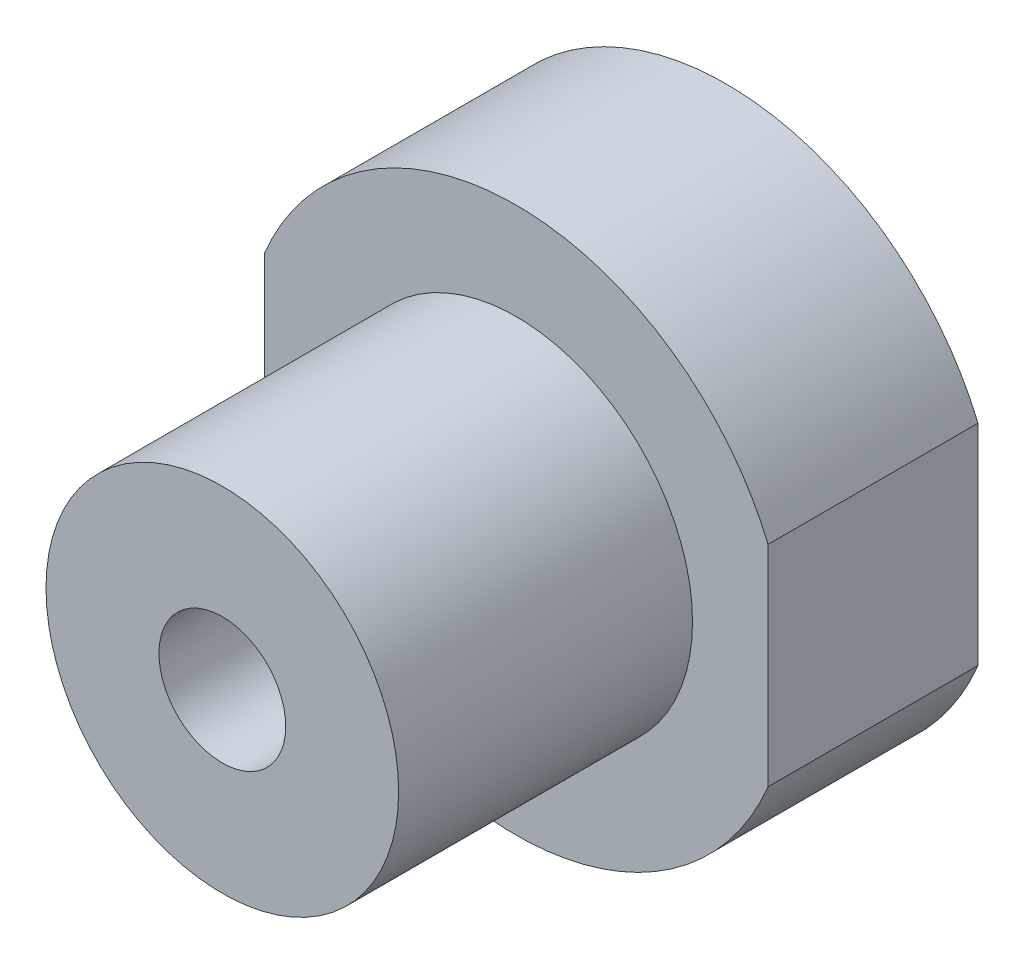
ISO-10303-21;
HEADER;
FILE_DESCRIPTION(('STEP AP214'),'2;1');
FILE_NAME('part.step','',(''),(''),'','','');
FILE_SCHEMA(('AUTOMOTIVE_DESIGN { 1 0 10303 214 1 1 1 1 }'));
ENDSEC;
DATA;
#1=APPLICATION_CONTEXT('core data for automotive mechanical design processes');
#2=APPLICATION_PROTOCOL_DEFINITION('international standard','automotive_design',2000,#1);
#3=PRODUCT_CONTEXT('',#1,'mechanical');
#4=PRODUCT('Part','Part','',(#3));
#5=PRODUCT_RELATED_PRODUCT_CATEGORY('part','',(#4));
#6=PRODUCT_DEFINITION_FORMATION('','',#4);
#7=PRODUCT_DEFINITION_CONTEXT('part definition',#1,'design');
#8=PRODUCT_DEFINITION('design','',#6,#7);
#9=PRODUCT_DEFINITION_SHAPE('','',#8);
#10=(LENGTH_UNIT() NAMED_UNIT(*) SI_UNIT(.MILLI.,.METRE.));
#11=(NAMED_UNIT(*) PLANE_ANGLE_UNIT() SI_UNIT($,.RADIAN.));
#12=(NAMED_UNIT(*) SI_UNIT($,.STERADIAN.) SOLID_ANGLE_UNIT());
#13=UNCERTAINTY_MEASURE_WITH_UNIT(LENGTH_MEASURE(1.E-05),#10,'distance_accuracy_value','');
#14=(GEOMETRIC_REPRESENTATION_CONTEXT(3) GLOBAL_UNCERTAINTY_ASSIGNED_CONTEXT((#13)) GLOBAL_UNIT_ASSIGNED_CONTEXT((#10,
#11,#12)) REPRESENTATION_CONTEXT('',''));
#15=CARTESIAN_POINT('',(0.,0.,0.));
#16=DIRECTION('',(0.,0.,1.));
#17=DIRECTION('',(1.,0.,0.));
#18=AXIS2_PLACEMENT_3D('',#15,#16,#17);
#19=CARTESIAN_POINT('',(0.,0.,12.));
#20=DIRECTION('',(0.,0.,-1.));
#21=DIRECTION('',(-1.,0.,0.));
#22=AXIS2_PLACEMENT_3D('',#19,#20,#21);
#23=CYLINDRICAL_SURFACE('',#22,6.5);
#24=CARTESIAN_POINT('',(0.,0.,5.));
#25=DIRECTION('',(0.,0.,1.));
#26=DIRECTION('',(1.,0.,0.));
#27=AXIS2_PLACEMENT_3D('',#24,#25,#26);
#28=CIRCLE('',#27,6.5);
#29=CARTESIAN_POINT('',(-6.,-2.5,5.));
#30=VERTEX_POINT('',#29);
#31=CARTESIAN_POINT('',(6.,-2.5,5.));
#32=VERTEX_POINT('',#31);
#33=EDGE_CURVE('E87',#30,#32,#28,.T.);
#34=ORIENTED_EDGE('',*,*,#33,.F.);
#35=DIRECTION('',(0.,0.,-1.));
#36=VECTOR('',#35,1.);
#37=CARTESIAN_POINT('',(-6.,-2.5,32.0777237780431));
#38=LINE('',#37,#36);
#39=CARTESIAN_POINT('',(-6.,-2.5,0.));
#40=VERTEX_POINT('',#39);
#41=EDGE_CURVE('E51',#30,#40,#38,.T.);
#42=ORIENTED_EDGE('',*,*,#41,.T.);
#43=CARTESIAN_POINT('',(0.,0.,0.));
#44=DIRECTION('',(0.,0.,1.));
#45=DIRECTION('',(1.,0.,0.));
#46=AXIS2_PLACEMENT_3D('',#43,#44,#45);
#47=CIRCLE('',#46,6.5);
#48=CARTESIAN_POINT('',(6.,-2.5,0.));
#49=VERTEX_POINT('',#48);
#50=EDGE_CURVE('E86',#40,#49,#47,.T.);
#51=ORIENTED_EDGE('',*,*,#50,.T.);
#52=DIRECTION('',(0.,0.,-1.));
#53=VECTOR('',#52,1.);
#54=CARTESIAN_POINT('',(6.,-2.5,38.6931230001252));
#55=LINE('',#54,#53);
#56=EDGE_CURVE('E99',#32,#49,#55,.T.);
#57=ORIENTED_EDGE('',*,*,#56,.F.);
#58=EDGE_LOOP('',(#34,#42,#51,#57));
#59=FACE_BOUND('',#58,.T.);
#60=ADVANCED_FACE('F36',(#59),#23,.T.);
#61=CARTESIAN_POINT('',(6.,2.5,0.));
#62=VERTEX_POINT('',#61);
#63=CARTESIAN_POINT('',(-6.,2.5,0.));
#64=VERTEX_POINT('',#63);
#65=EDGE_CURVE('E91',#62,#64,#47,.T.);
#66=ORIENTED_EDGE('',*,*,#65,.T.);
#67=DIRECTION('',(0.,0.,-1.));
#68=VECTOR('',#67,1.);
#69=CARTESIAN_POINT('',(-6.,2.5,32.0777237780431));
#70=LINE('',#69,#68);
#71=CARTESIAN_POINT('',(-6.,2.5,5.00000000000001));
#72=VERTEX_POINT('',#71);
#73=EDGE_CURVE('E90',#72,#64,#70,.T.);
#74=ORIENTED_EDGE('',*,*,#73,.F.);
#75=CARTESIAN_POINT('',(6.,2.5,5.));
#76=VERTEX_POINT('',#75);
#77=EDGE_CURVE('E79',#76,#72,#28,.T.);
#78=ORIENTED_EDGE('',*,*,#77,.F.);
#79=DIRECTION('',(0.,0.,-1.));
#80=VECTOR('',#79,1.);
#81=CARTESIAN_POINT('',(6.,2.5,38.6931230001252));
#82=LINE('',#81,#80);
#83=EDGE_CURVE('E96',#76,#62,#82,.T.);
#84=ORIENTED_EDGE('',*,*,#83,.T.);
#85=EDGE_LOOP('',(#66,#74,#78,#84));
#86=FACE_BOUND('',#85,.T.);
#87=ADVANCED_FACE('F38',(#86),#23,.T.);
#88=CARTESIAN_POINT('',(0.,0.,0.));
#89=DIRECTION('',(0.,0.,1.));
#90=DIRECTION('',(1.,0.,0.));
#91=AXIS2_PLACEMENT_3D('',#88,#89,#90);
#92=PLANE('',#91);
#93=ORIENTED_EDGE('',*,*,#50,.F.);
#94=DIRECTION('',(0.,1.,0.));
#95=VECTOR('',#94,1.);
#96=CARTESIAN_POINT('',(-6.,0.,0.));
#97=LINE('',#96,#95);
#98=EDGE_CURVE('E58',#40,#64,#97,.T.);
#99=ORIENTED_EDGE('',*,*,#98,.T.);
#100=ORIENTED_EDGE('',*,*,#65,.F.);
#101=DIRECTION('',(0.,1.,0.));
#102=VECTOR('',#101,1.);
#103=CARTESIAN_POINT('',(6.,0.,0.));
#104=LINE('',#103,#102);
#105=EDGE_CURVE('E102',#49,#62,#104,.T.);
#106=ORIENTED_EDGE('',*,*,#105,.F.);
#107=EDGE_LOOP('',(#93,#99,#100,#106));
#108=FACE_BOUND('',#107,.T.);
#109=ADVANCED_FACE('F142',(#108),#92,.F.);
#110=CARTESIAN_POINT('',(0.,0.,5.));
#111=DIRECTION('',(0.,0.,1.));
#112=DIRECTION('',(1.,0.,0.));
#113=AXIS2_PLACEMENT_3D('',#110,#111,#112);
#114=PLANE('',#113);
#115=DIRECTION('',(0.,1.,0.));
#116=VECTOR('',#115,1.);
#117=CARTESIAN_POINT('',(-6.,0.,5.));
#118=LINE('',#117,#116);
#119=EDGE_CURVE('E12',#30,#72,#118,.T.);
#120=ORIENTED_EDGE('',*,*,#119,.F.);
#121=ORIENTED_EDGE('',*,*,#33,.T.);
#122=DIRECTION('',(0.,1.,0.));
#123=VECTOR('',#122,1.);
#124=CARTESIAN_POINT('',(6.,0.,5.));
#125=LINE('',#124,#123);
#126=EDGE_CURVE('E44',#32,#76,#125,.T.);
#127=ORIENTED_EDGE('',*,*,#126,.T.);
#128=ORIENTED_EDGE('',*,*,#77,.T.);
#129=EDGE_LOOP('',(#120,#121,#127,#128));
#130=FACE_BOUND('',#129,.T.);
#131=CARTESIAN_POINT('',(0.,0.,5.));
#132=DIRECTION('',(0.,0.,1.));
#133=DIRECTION('',(1.,0.,0.));
#134=AXIS2_PLACEMENT_3D('',#131,#132,#133);
#135=CIRCLE('',#134,4.2);
#136=CARTESIAN_POINT('',(4.2,0.,5.));
#137=VERTEX_POINT('',#136);
#138=EDGE_CURVE('E153',#137,#137,#135,.T.);
#139=ORIENTED_EDGE('',*,*,#138,.F.);
#140=EDGE_LOOP('',(#139));
#141=FACE_BOUND('',#140,.T.);
#142=ADVANCED_FACE('F81',(#130,#141),#114,.T.);
#143=CARTESIAN_POINT('',(0.,0.,5.));
#144=DIRECTION('',(0.,0.,1.));
#145=DIRECTION('',(1.,0.,0.));
#146=AXIS2_PLACEMENT_3D('',#143,#144,#145);
#147=CYLINDRICAL_SURFACE('',#146,4.2);
#148=CARTESIAN_POINT('',(-4.2,0.,9.8));
#149=CARTESIAN_POINT('',(-4.19999918975716,0.0445050692827186,9.79999831351455));
#150=CARTESIAN_POINT('',(-4.19928531303912,0.0890319340393675,9.79627363588427));
#151=CARTESIAN_POINT('',(-4.19650633670306,0.176830026339232,9.78148345009533));
#152=CARTESIAN_POINT('',(-4.1944401122718,0.220100177296127,9.77041183102234));
#153=CARTESIAN_POINT('',(-4.18918747855958,0.304102472931484,9.74127979887013));
#154=CARTESIAN_POINT('',(-4.18600209548577,0.344836902582766,9.72322578673946));
#155=CARTESIAN_POINT('',(-4.17885862129986,0.422694978519967,9.680659825203));
#156=CARTESIAN_POINT('',(-4.17490058887378,0.459818898718858,9.6561483662185));
#157=CARTESIAN_POINT('',(-4.16659378019184,0.529863819055358,9.60104229368466));
#158=CARTESIAN_POINT('',(-4.16224116830176,0.562733824115327,9.57038343225021));
#159=CARTESIAN_POINT('',(-4.15366410352382,0.622896603773796,9.50399103156161));
#160=CARTESIAN_POINT('',(-4.14943966004354,0.650188969812237,9.46825712088664));
#161=CARTESIAN_POINT('',(-4.14155991678934,0.698634996766379,9.39236709231777));
#162=CARTESIAN_POINT('',(-4.1379095601114,0.719736567014677,9.35217716275601));
#163=CARTESIAN_POINT('',(-4.13164544256769,0.75486848530436,9.26874146295891));
#164=CARTESIAN_POINT('',(-4.12903158931043,0.768899463631998,9.22549596549479));
#165=CARTESIAN_POINT('',(-4.12517508116456,0.789327808131856,9.13772306288837));
#166=CARTESIAN_POINT('',(-4.12391644213396,0.795814233858233,9.09321710185931));
#167=CARTESIAN_POINT('',(-4.12286469754441,0.801245827857894,9.00373215981581));
#168=CARTESIAN_POINT('',(-4.12307145629921,0.80019169433754,8.9587532229809));
#169=CARTESIAN_POINT('',(-4.12491260039502,0.790644259726365,8.87024581490186));
#170=CARTESIAN_POINT('',(-4.12652751367668,0.782252420573193,8.82670593377052));
#171=CARTESIAN_POINT('',(-4.13097240400575,0.758427660713511,8.74166356782844));
#172=CARTESIAN_POINT('',(-4.13380243417989,0.742994432145178,8.70016117218801));
#173=CARTESIAN_POINT('',(-4.14037893640687,0.705426306897761,8.62007604639157));
#174=CARTESIAN_POINT('',(-4.14413095945861,0.683250616774925,8.58151292721929));
#175=CARTESIAN_POINT('',(-4.15212504340384,0.632855889425938,8.50861693675805));
#176=CARTESIAN_POINT('',(-4.15636715554572,0.604636219919831,8.4742845086476));
#177=CARTESIAN_POINT('',(-4.16494817022137,0.542408431522876,8.41023842778877));
#178=CARTESIAN_POINT('',(-4.16928752431716,0.508313572123825,8.38060904908835));
#179=CARTESIAN_POINT('',(-4.17751068538924,0.435593015952664,8.32747750451272));
#180=CARTESIAN_POINT('',(-4.18139448751623,0.396967270958417,8.30397540385862));
#181=CARTESIAN_POINT('',(-4.18827716875703,0.316192152772242,8.26375240166464));
#182=CARTESIAN_POINT('',(-4.19127487630327,0.274038208299115,8.24704046704623));
#183=CARTESIAN_POINT('',(-4.19603859426372,0.187451496048365,8.22095847130397));
#184=CARTESIAN_POINT('',(-4.19780473977526,0.143018978795102,8.21158760488099));
#185=CARTESIAN_POINT('',(-4.19988772003309,0.0538612408665728,8.20057151854554));
#186=CARTESIAN_POINT('',(-4.2002262083733,0.00915077282118806,8.19881086259992));
#187=CARTESIAN_POINT('',(-4.1994756266672,-0.0799256443228178,8.20275524211939));
#188=CARTESIAN_POINT('',(-4.19838662909885,-0.124291610797819,8.2084598985471));
#189=CARTESIAN_POINT('',(-4.19491693619439,-0.211052035228773,8.22707701053263));
#190=CARTESIAN_POINT('',(-4.1925467470456,-0.253459524728257,8.23993086482557));
#191=CARTESIAN_POINT('',(-4.18677936440468,-0.33551748546553,8.27241793898824));
#192=CARTESIAN_POINT('',(-4.18338209946126,-0.375167764654425,8.29205163052914));
#193=CARTESIAN_POINT('',(-4.175883399201,-0.451077080490726,8.33779520206983));
#194=CARTESIAN_POINT('',(-4.17177448000834,-0.487293002507809,8.36397537668185));
#195=CARTESIAN_POINT('',(-4.16332715336028,-0.554858983744039,8.42197386753347));
#196=CARTESIAN_POINT('',(-4.15898872377015,-0.586208572486981,8.45379272828413));
#197=CARTESIAN_POINT('',(-4.1504992386728,-0.643592231069949,8.52268865979902));
#198=CARTESIAN_POINT('',(-4.14635157353834,-0.669547411518764,8.55983192575681));
#199=CARTESIAN_POINT('',(-4.1387822874362,-0.71485025802538,8.63801902788005));
#200=CARTESIAN_POINT('',(-4.13536063896864,-0.734198174368418,8.67906271622096));
#201=CARTESIAN_POINT('',(-4.12965758647247,-0.765626389342317,8.76368838883063));
#202=CARTESIAN_POINT('',(-4.12737059311941,-0.777742373789275,8.80725672576706));
#203=CARTESIAN_POINT('',(-4.12418323447374,-0.79447244488251,8.89585850859045));
#204=CARTESIAN_POINT('',(-4.12328270713451,-0.799087408232481,8.94089178263097));
#205=CARTESIAN_POINT('',(-4.12297864271789,-0.80065437113446,9.03035447569308));
#206=CARTESIAN_POINT('',(-4.12355078592255,-0.797730859810025,9.07478167907047));
#207=CARTESIAN_POINT('',(-4.12607357441173,-0.784576922525489,9.16249891845475));
#208=CARTESIAN_POINT('',(-4.12802421082699,-0.77434654357789,9.2057889617763));
#209=CARTESIAN_POINT('',(-4.13307380831457,-0.746922507433793,9.28993321942199));
#210=CARTESIAN_POINT('',(-4.13617047660353,-0.729742747023456,9.33079210940258));
#211=CARTESIAN_POINT('',(-4.14316476734079,-0.688921385354746,9.40906739047722));
#212=CARTESIAN_POINT('',(-4.14706244886079,-0.6652793074823,9.44648352738638));
#213=CARTESIAN_POINT('',(-4.15529483720025,-0.61177339459019,9.51743392706396));
#214=CARTESIAN_POINT('',(-4.15963536316529,-0.58181912036121,9.550899323472));
#215=CARTESIAN_POINT('',(-4.16822125389376,-0.516727266780006,9.61237013600578));
#216=CARTESIAN_POINT('',(-4.17246659657047,-0.481588498447137,9.64037429625506));
#217=CARTESIAN_POINT('',(-4.18043033987948,-0.406731751047044,9.69037260514626));
#218=CARTESIAN_POINT('',(-4.18414345046217,-0.366974080018692,9.71230819816285));
#219=CARTESIAN_POINT('',(-4.19057261857685,-0.284279155063621,9.7491531353614));
#220=CARTESIAN_POINT('',(-4.19328960334228,-0.24134490300338,9.76406901745668));
#221=CARTESIAN_POINT('',(-4.19687250857602,-0.165242674233967,9.7834549491363));
#222=CARTESIAN_POINT('',(-4.19803863895636,-0.132516977430961,9.7896486339844));
#223=CARTESIAN_POINT('',(-4.19960267722617,-0.0665315713578867,9.79792173460682));
#224=CARTESIAN_POINT('',(-4.20000060573549,-0.0332718764454042,9.80000126081223));
#225=CARTESIAN_POINT('',(-4.2,0.,9.8));
#226=B_SPLINE_CURVE_WITH_KNOTS('',3,(#148,#149,#150,#151,#152,#153,#154,#155,#156,#157,#158,
#159,#160,#161,#162,#163,#164,#165,#166,#167,#168,#169,#170,#171,#172,#173,#174,#175,#176,#177,
#178,#179,#180,#181,#182,#183,#184,#185,#186,#187,#188,#189,#190,#191,#192,#193,#194,#195,#196,
#197,#198,#199,#200,#201,#202,#203,#204,#205,#206,#207,#208,#209,#210,#211,#212,#213,#214,#215,
#216,#217,#218,#219,#220,#221,#222,#223,#224,#225),.UNSPECIFIED.,.T.,.F.,(4,2,2,2,2,2,2,2,2,2,2,
2,2,2,2,2,2,2,2,2,2,2,2,2,2,2,2,2,2,2,2,2,2,2,2,2,2,2,4),(0.,0.133393520972016,
0.266898133049502,0.400280646833109,0.53365303358406,0.668499713214935,0.80335626677924,
0.939316968024612,1.075265547325,1.2095924925506,1.34390700014252,1.4763931346295,
1.60888506219647,1.7421951095463,1.87551910970308,2.01101318237692,2.14650869724269,
2.28218256699814,2.41784155154178,2.55143539720534,2.68502246015263,2.81753032607892,
2.95004741239425,3.0840536114793,3.21807275820069,3.35393193388066,3.48978596260145,
3.62496395832761,3.76012615359527,3.89307064957235,4.02601429019012,4.15869338531743,
4.29138226854241,4.42612014354719,4.56088896669263,4.69691610068412,4.83281629180201,
4.93254362522872,5.03226828176626),.UNSPECIFIED.);
#227=CARTESIAN_POINT('',(-4.2,0.,9.8));
#228=VERTEX_POINT('',#227);
#229=EDGE_CURVE('E129',#228,#228,#226,.T.);
#230=ORIENTED_EDGE('',*,*,#229,.F.);
#231=EDGE_LOOP('',(#230));
#232=FACE_BOUND('',#231,.T.);
#233=ORIENTED_EDGE('',*,*,#138,.T.);
#234=EDGE_LOOP('',(#233));
#235=FACE_BOUND('',#234,.T.);
#236=CARTESIAN_POINT('',(0.,0.,12.));
#237=DIRECTION('',(0.,0.,1.));
#238=DIRECTION('',(1.,0.,0.));
#239=AXIS2_PLACEMENT_3D('',#236,#237,#238);
#240=CIRCLE('',#239,4.2);
#241=CARTESIAN_POINT('',(4.2,0.,12.));
#242=VERTEX_POINT('',#241);
#243=EDGE_CURVE('E155',#242,#242,#240,.T.);
#244=ORIENTED_EDGE('',*,*,#243,.F.);
#245=EDGE_LOOP('',(#244));
#246=FACE_BOUND('',#245,.T.);
#247=ADVANCED_FACE('F134',(#232,#235,#246),#147,.T.);
#248=CARTESIAN_POINT('',(0.,0.,12.));
#249=DIRECTION('',(0.,0.,1.));
#250=DIRECTION('',(1.,0.,0.));
#251=AXIS2_PLACEMENT_3D('',#248,#249,#250);
#252=PLANE('',#251);
#253=CARTESIAN_POINT('',(0.,0.,12.));
#254=DIRECTION('',(0.,0.,1.));
#255=DIRECTION('',(1.,0.,0.));
#256=AXIS2_PLACEMENT_3D('',#253,#254,#255);
#257=CIRCLE('',#256,1.51);
#258=CARTESIAN_POINT('',(1.51,0.,12.));
#259=VERTEX_POINT('',#258);
#260=EDGE_CURVE('E112',#259,#259,#257,.T.);
#261=ORIENTED_EDGE('',*,*,#260,.F.);
#262=EDGE_LOOP('',(#261));
#263=FACE_BOUND('',#262,.T.);
#264=ORIENTED_EDGE('',*,*,#243,.T.);
#265=EDGE_LOOP('',(#264));
#266=FACE_BOUND('',#265,.T.);
#267=ADVANCED_FACE('F138',(#263,#266),#252,.T.);
#268=CARTESIAN_POINT('',(0.,0.,5.));
#269=DIRECTION('',(0.,0.,1.));
#270=DIRECTION('',(1.,0.,0.));
#271=AXIS2_PLACEMENT_3D('',#268,#269,#270);
#272=CYLINDRICAL_SURFACE('',#271,1.51);
#273=CARTESIAN_POINT('',(-1.51,0.,9.8));
#274=CARTESIAN_POINT('',(-1.50999758320691,0.0417510833330522,9.79999728333977));
#275=CARTESIAN_POINT('',(-1.5082503596257,0.0835426385364564,9.79671254056916));
#276=CARTESIAN_POINT('',(-1.50143280043036,0.16587126846474,9.7837281318983));
#277=CARTESIAN_POINT('',(-1.49635719064945,0.206406245071953,9.77401828454383));
#278=CARTESIAN_POINT('',(-1.48340942306705,0.28490928358444,9.74867967540217));
#279=CARTESIAN_POINT('',(-1.47554854763877,0.322886976421819,9.73307477627369));
#280=CARTESIAN_POINT('',(-1.45773474594787,0.395617804111763,9.69652337717232));
#281=CARTESIAN_POINT('',(-1.44778182785209,0.430370951551433,9.67557689805164));
#282=CARTESIAN_POINT('',(-1.42591133121044,0.498226235408713,9.62738674895102));
#283=CARTESIAN_POINT('',(-1.41390776035784,0.53107105998104,9.59982043798002));
#284=CARTESIAN_POINT('',(-1.38953791191531,0.591912629260072,9.53987585363182));
#285=CARTESIAN_POINT('',(-1.37717133186275,0.619905188746699,9.50749347053541));
#286=CARTESIAN_POINT('',(-1.35218376107951,0.672776923462393,9.4353679064447));
#287=CARTESIAN_POINT('',(-1.33963944940714,0.697151609564679,9.39522501575421));
#288=CARTESIAN_POINT('',(-1.31718530593836,0.738704309259306,9.31069125909295));
#289=CARTESIAN_POINT('',(-1.30727345339324,0.755887848843211,9.26630368726517));
#290=CARTESIAN_POINT('',(-1.29218715062612,0.78138410113511,9.17732237639986));
#291=CARTESIAN_POINT('',(-1.28675596774797,0.790182893621159,9.13291386626607));
#292=CARTESIAN_POINT('',(-1.28060207974399,0.800122940321714,9.04294792178661));
#293=CARTESIAN_POINT('',(-1.27987358237035,0.80127361469393,8.99739197022521));
#294=CARTESIAN_POINT('',(-1.28300633802695,0.796239537306053,8.91322371158308));
#295=CARTESIAN_POINT('',(-1.28624651603498,0.791047660219459,8.87452275997874));
#296=CARTESIAN_POINT('',(-1.29584830152839,0.775217437383522,8.79865367228148));
#297=CARTESIAN_POINT('',(-1.30221113286559,0.764576956108656,8.76148614337476));
#298=CARTESIAN_POINT('',(-1.31746612096692,0.737984560827303,8.68868687590585));
#299=CARTESIAN_POINT('',(-1.32641221809757,0.721917983933765,8.65310886933628));
#300=CARTESIAN_POINT('',(-1.3458372092223,0.685023023364196,8.58497446635857));
#301=CARTESIAN_POINT('',(-1.35631678423809,0.664192521690497,8.55241942301126));
#302=CARTESIAN_POINT('',(-1.37945550081804,0.614855224480314,8.4862961494733));
#303=CARTESIAN_POINT('',(-1.39221059804257,0.585673809839336,8.45326300413945));
#304=CARTESIAN_POINT('',(-1.41725150917399,0.522172149883079,8.39232054994712));
#305=CARTESIAN_POINT('',(-1.42953704032721,0.487848867678317,8.36441429096223));
#306=CARTESIAN_POINT('',(-1.45311880702332,0.412539906674086,8.31297221736981));
#307=CARTESIAN_POINT('',(-1.4643162186282,0.371283143406586,8.28978413150751));
#308=CARTESIAN_POINT('',(-1.48357574501624,0.284714556362572,8.25087799579696));
#309=CARTESIAN_POINT('',(-1.49164062472605,0.239406352248664,8.23515335561052));
#310=CARTESIAN_POINT('',(-1.5031065449172,0.150345796734096,8.21303753523191));
#311=CARTESIAN_POINT('',(-1.50685932853704,0.106814958015096,8.20593913212916));
#312=CARTESIAN_POINT('',(-1.51051765761515,0.0190267203576006,8.19901733389283));
#313=CARTESIAN_POINT('',(-1.5104253813453,-0.0252302530113215,8.19918981971536));
#314=CARTESIAN_POINT('',(-1.50659251985524,-0.108999019638349,8.20644591666062));
#315=CARTESIAN_POINT('',(-1.50317829978764,-0.148581772567794,8.21291130077265));
#316=CARTESIAN_POINT('',(-1.49350040989578,-0.226006950078972,8.23155557872626));
#317=CARTESIAN_POINT('',(-1.48723644186283,-0.263849192070452,8.24373507051837));
#318=CARTESIAN_POINT('',(-1.47221556132325,-0.337852400886975,8.27371434056559));
#319=CARTESIAN_POINT('',(-1.46339936313651,-0.373946238827178,8.29164903052487));
#320=CARTESIAN_POINT('',(-1.44408395118452,-0.442718183425221,8.3324660822866));
#321=CARTESIAN_POINT('',(-1.43358407312237,-0.47539493342664,8.35535039821524));
#322=CARTESIAN_POINT('',(-1.41055963959757,-0.540114078423906,8.40821950561035));
#323=CARTESIAN_POINT('',(-1.39793859716561,-0.571716550110246,8.43870144544075));
#324=CARTESIAN_POINT('',(-1.37285239476004,-0.62958161721423,8.50447183432646));
#325=CARTESIAN_POINT('',(-1.36038738470145,-0.655839399347286,8.53976456852282));
#326=CARTESIAN_POINT('',(-1.33617368841882,-0.703925774644472,8.61699954086527));
#327=CARTESIAN_POINT('',(-1.32452468393028,-0.725354001494876,8.65922528549606));
#328=CARTESIAN_POINT('',(-1.304619728749,-0.760579927939961,8.74747851796025));
#329=CARTESIAN_POINT('',(-1.29635898644648,-0.774388412832173,8.79350052571962));
#330=CARTESIAN_POINT('',(-1.28528066661617,-0.792627078355195,8.88325836456235));
#331=CARTESIAN_POINT('',(-1.2820091196606,-0.797843498810931,8.92677646486662));
#332=CARTESIAN_POINT('',(-1.27999927746353,-0.80106643314187,9.01417242451902));
#333=CARTESIAN_POINT('',(-1.28125803832037,-0.799077629137555,9.0580500317596));
#334=CARTESIAN_POINT('',(-1.28766372946015,-0.788701567596343,9.13939063844286));
#335=CARTESIAN_POINT('',(-1.29233185500144,-0.781101079005731,9.17699726578141));
#336=CARTESIAN_POINT('',(-1.30439941502693,-0.76077657848467,9.25033549665183));
#337=CARTESIAN_POINT('',(-1.31179984338933,-0.748050702035449,9.28606641248292));
#338=CARTESIAN_POINT('',(-1.32907622686995,-0.716932106547437,9.35723092433302));
#339=CARTESIAN_POINT('',(-1.33908171456777,-0.698225100762954,9.39249458985094));
#340=CARTESIAN_POINT('',(-1.36026949978443,-0.655991654951438,9.45961865397367));
#341=CARTESIAN_POINT('',(-1.37145242947902,-0.632462619465174,9.49147720566462));
#342=CARTESIAN_POINT('',(-1.39563504881244,-0.577348299267899,9.55560868586821));
#343=CARTESIAN_POINT('',(-1.40866707153628,-0.545093311172849,9.58729708088607));
#344=CARTESIAN_POINT('',(-1.43367631607179,-0.475437957990641,9.64498370216012));
#345=CARTESIAN_POINT('',(-1.44565286653601,-0.438034356253173,9.67097832220441));
#346=CARTESIAN_POINT('',(-1.46755867313869,-0.357955166532462,9.71697040956236));
#347=CARTESIAN_POINT('',(-1.47743665333846,-0.315181081636767,9.73682214107706));
#348=CARTESIAN_POINT('',(-1.49363045054913,-0.226261753678211,9.76878063420636));
#349=CARTESIAN_POINT('',(-1.49995584712799,-0.180125959205446,9.78090823595898));
#350=CARTESIAN_POINT('',(-1.5060616464918,-0.111213776879901,9.79254622646638));
#351=CARTESIAN_POINT('',(-1.50753355457518,-0.089093602051376,9.79533627023021));
#352=CARTESIAN_POINT('',(-1.50950338527061,-0.044652813311007,9.79906389797581));
#353=CARTESIAN_POINT('',(-1.5100012927161,-0.0223321962834316,9.80000145311174));
#354=CARTESIAN_POINT('',(-1.51,0.,9.8));
#355=B_SPLINE_CURVE_WITH_KNOTS('',3,(#273,#274,#275,#276,#277,#278,#279,#280,#281,#282,#283,
#284,#285,#286,#287,#288,#289,#290,#291,#292,#293,#294,#295,#296,#297,#298,#299,#300,#301,#302,
#303,#304,#305,#306,#307,#308,#309,#310,#311,#312,#313,#314,#315,#316,#317,#318,#319,#320,#321,
#322,#323,#324,#325,#326,#327,#328,#329,#330,#331,#332,#333,#334,#335,#336,#337,#338,#339,#340,
#341,#342,#343,#344,#345,#346,#347,#348,#349,#350,#351,#352,#353,#354),.UNSPECIFIED.,.T.,.F.,(4,
2,2,2,2,2,2,2,2,2,2,2,2,2,2,2,2,2,2,2,2,2,2,2,2,2,2,2,2,2,2,2,2,2,2,2,2,2,2,2,4),(0.,
0.125163093703758,0.250525001894443,0.375384800936085,0.500244112563392,0.633283136646878,
0.766436345874363,0.911533200019375,1.05651834974291,1.19246830555583,1.32825078125031,
1.44524691535973,1.56228894006366,1.68197754993144,1.80171947607015,1.93878880748868,
2.07593941630806,2.2210513632838,2.36603493467133,2.49809055549209,2.63007136626001,
2.75027222174959,2.8704856584169,2.99375285644976,3.11706880984078,3.25354608321694,
3.39014572582304,3.53565097475619,3.68094973777827,3.81201395412771,3.94299301721737,
4.05843914697632,4.17392731183305,4.29691382809691,4.41996671658247,4.56050706550043,
4.70113617136929,4.8448830704588,4.98824047073637,5.05518779351742,5.12213615875471),.UNSPECIFIED.);
#356=CARTESIAN_POINT('',(-1.51,0.,9.8));
#357=VERTEX_POINT('',#356);
#358=EDGE_CURVE('E105',#357,#357,#355,.T.);
#359=ORIENTED_EDGE('',*,*,#358,.T.);
#360=EDGE_LOOP('',(#359));
#361=FACE_BOUND('',#360,.T.);
#362=CARTESIAN_POINT('',(0.,0.,5.));
#363=DIRECTION('',(0.,0.,1.));
#364=DIRECTION('',(1.,0.,0.));
#365=AXIS2_PLACEMENT_3D('',#362,#363,#364);
#366=CIRCLE('',#365,1.51);
#367=CARTESIAN_POINT('',(1.51,0.,5.));
#368=VERTEX_POINT('',#367);
#369=EDGE_CURVE('E113',#368,#368,#366,.T.);
#370=ORIENTED_EDGE('',*,*,#369,.F.);
#371=EDGE_LOOP('',(#370));
#372=FACE_BOUND('',#371,.T.);
#373=ORIENTED_EDGE('',*,*,#260,.T.);
#374=EDGE_LOOP('',(#373));
#375=FACE_BOUND('',#374,.T.);
#376=ADVANCED_FACE('F115',(#361,#372,#375),#272,.F.);
#377=CARTESIAN_POINT('',(0.,0.,5.));
#378=DIRECTION('',(0.,0.,1.));
#379=DIRECTION('',(1.,0.,0.));
#380=AXIS2_PLACEMENT_3D('',#377,#378,#379);
#381=PLANE('',#380);
#382=ORIENTED_EDGE('',*,*,#369,.T.);
#383=EDGE_LOOP('',(#382));
#384=FACE_BOUND('',#383,.T.);
#385=ADVANCED_FACE('F124',(#384),#381,.T.);
#386=CARTESIAN_POINT('',(-4.2,0.,9.));
#387=DIRECTION('',(-1.,0.,0.));
#388=DIRECTION('',(0.,0.,1.));
#389=AXIS2_PLACEMENT_3D('',#386,#387,#388);
#390=CYLINDRICAL_SURFACE('',#389,0.799999999999999);
#391=ORIENTED_EDGE('',*,*,#229,.T.);
#392=EDGE_LOOP('',(#391));
#393=FACE_BOUND('',#392,.T.);
#394=ORIENTED_EDGE('',*,*,#358,.F.);
#395=EDGE_LOOP('',(#394));
#396=FACE_BOUND('',#395,.T.);
#397=ADVANCED_FACE('F119',(#393,#396),#390,.F.);
#398=CARTESIAN_POINT('',(6.,2.5,38.6931230001252));
#399=DIRECTION('',(1.,0.,0.));
#400=DIRECTION('',(0.,1.,0.));
#401=AXIS2_PLACEMENT_3D('',#398,#399,#400);
#402=PLANE('',#401);
#403=ORIENTED_EDGE('',*,*,#56,.T.);
#404=ORIENTED_EDGE('',*,*,#105,.T.);
#405=ORIENTED_EDGE('',*,*,#83,.F.);
#406=ORIENTED_EDGE('',*,*,#126,.F.);
#407=EDGE_LOOP('',(#403,#404,#405,#406));
#408=FACE_BOUND('',#407,.T.);
#409=ADVANCED_FACE('F123',(#408),#402,.T.);
#410=CARTESIAN_POINT('',(-6.,2.5,32.0777237780431));
#411=DIRECTION('',(1.,0.,0.));
#412=DIRECTION('',(0.,0.,-1.));
#413=AXIS2_PLACEMENT_3D('',#410,#411,#412);
#414=PLANE('',#413);
#415=ORIENTED_EDGE('',*,*,#98,.F.);
#416=ORIENTED_EDGE('',*,*,#41,.F.);
#417=ORIENTED_EDGE('',*,*,#119,.T.);
#418=ORIENTED_EDGE('',*,*,#73,.T.);
#419=EDGE_LOOP('',(#415,#416,#417,#418));
#420=FACE_BOUND('',#419,.T.);
#421=ADVANCED_FACE('F94',(#420),#414,.F.);
#422=CLOSED_SHELL('',(#60,#87,#109,#142,#247,#267,#376,#385,#397,#409,#421));
#423=MANIFOLD_SOLID_BREP('B2',#422);
#424=ADVANCED_BREP_SHAPE_REPRESENTATION('',(#18,#423),#14);
#425=SHAPE_DEFINITION_REPRESENTATION(#9,#424);
ENDSEC;
END-ISO-10303-21;
